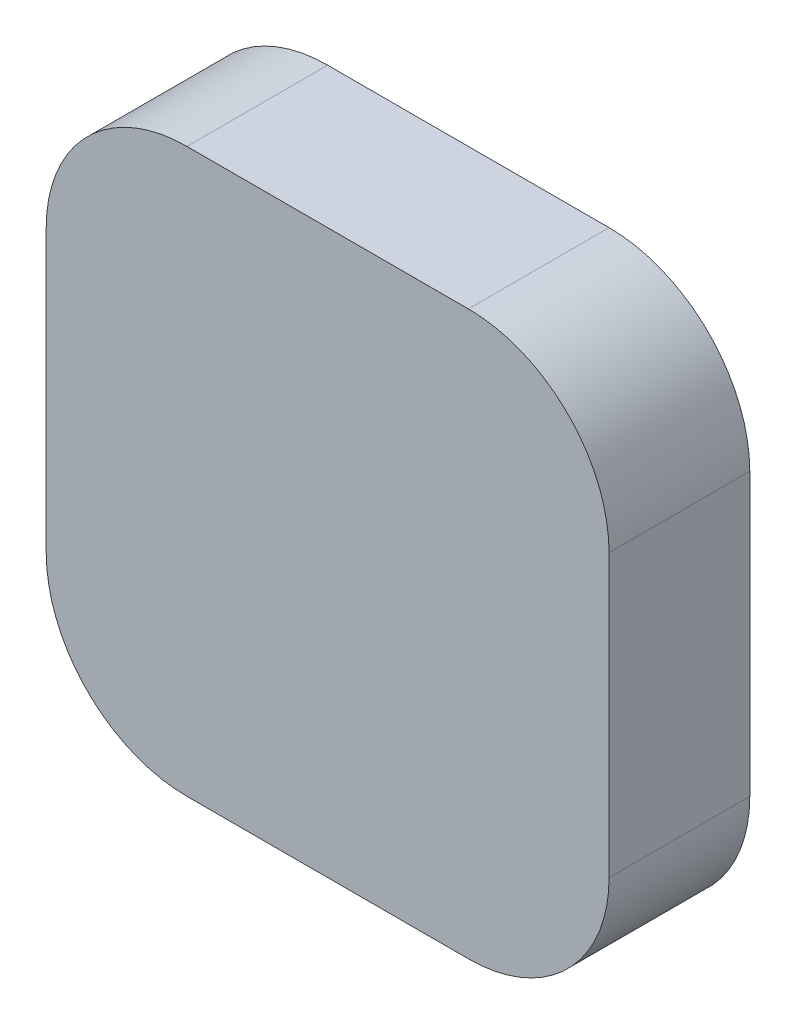
ISO-10303-21;
HEADER;
FILE_DESCRIPTION(('STEP AP214'),'2;1');
FILE_NAME('part.step','',(''),(''),'','','');
FILE_SCHEMA(('AUTOMOTIVE_DESIGN { 1 0 10303 214 1 1 1 1 }'));
ENDSEC;
DATA;
#1=APPLICATION_CONTEXT('core data for automotive mechanical design processes');
#2=APPLICATION_PROTOCOL_DEFINITION('international standard','automotive_design',2000,#1);
#3=PRODUCT_CONTEXT('',#1,'mechanical');
#4=PRODUCT('Part','Part','',(#3));
#5=PRODUCT_RELATED_PRODUCT_CATEGORY('part','',(#4));
#6=PRODUCT_DEFINITION_FORMATION('','',#4);
#7=PRODUCT_DEFINITION_CONTEXT('part definition',#1,'design');
#8=PRODUCT_DEFINITION('design','',#6,#7);
#9=PRODUCT_DEFINITION_SHAPE('','',#8);
#10=(LENGTH_UNIT() NAMED_UNIT(*) SI_UNIT(.MILLI.,.METRE.));
#11=(NAMED_UNIT(*) PLANE_ANGLE_UNIT() SI_UNIT($,.RADIAN.));
#12=(NAMED_UNIT(*) SI_UNIT($,.STERADIAN.) SOLID_ANGLE_UNIT());
#13=UNCERTAINTY_MEASURE_WITH_UNIT(LENGTH_MEASURE(1.E-05),#10,'distance_accuracy_value','');
#14=(GEOMETRIC_REPRESENTATION_CONTEXT(3) GLOBAL_UNCERTAINTY_ASSIGNED_CONTEXT((#13)) GLOBAL_UNIT_ASSIGNED_CONTEXT((#10,
#11,#12)) REPRESENTATION_CONTEXT('',''));
#15=CARTESIAN_POINT('',(0.,0.,0.));
#16=DIRECTION('',(0.,0.,1.));
#17=DIRECTION('',(1.,0.,0.));
#18=AXIS2_PLACEMENT_3D('',#15,#16,#17);
#19=CARTESIAN_POINT('',(0.,0.,5.));
#20=DIRECTION('',(1.,0.,0.));
#21=DIRECTION('',(0.,0.,-1.));
#22=AXIS2_PLACEMENT_3D('',#19,#20,#21);
#23=PLANE('',#22);
#24=DIRECTION('',(0.,-1.,0.));
#25=VECTOR('',#24,1.);
#26=CARTESIAN_POINT('',(0.,0.,0.));
#27=LINE('',#26,#25);
#28=CARTESIAN_POINT('',(0.,15.,0.));
#29=VERTEX_POINT('',#28);
#30=CARTESIAN_POINT('',(0.,5.,0.));
#31=VERTEX_POINT('',#30);
#32=EDGE_CURVE('E128',#29,#31,#27,.T.);
#33=ORIENTED_EDGE('',*,*,#32,.T.);
#34=DIRECTION('',(0.,0.,-1.));
#35=VECTOR('',#34,1.);
#36=CARTESIAN_POINT('',(0.,5.,5.));
#37=LINE('',#36,#35);
#38=CARTESIAN_POINT('',(0.,5.,5.));
#39=VERTEX_POINT('',#38);
#40=EDGE_CURVE('E151',#31,#39,#37,.F.);
#41=ORIENTED_EDGE('',*,*,#40,.T.);
#42=DIRECTION('',(0.,-1.,0.));
#43=VECTOR('',#42,1.);
#44=CARTESIAN_POINT('',(0.,0.,5.));
#45=LINE('',#44,#43);
#46=CARTESIAN_POINT('',(0.,15.,5.));
#47=VERTEX_POINT('',#46);
#48=EDGE_CURVE('E126',#47,#39,#45,.T.);
#49=ORIENTED_EDGE('',*,*,#48,.F.);
#50=DIRECTION('',(0.,0.,-1.));
#51=VECTOR('',#50,1.);
#52=CARTESIAN_POINT('',(0.,15.,5.));
#53=LINE('',#52,#51);
#54=EDGE_CURVE('E148',#47,#29,#53,.T.);
#55=ORIENTED_EDGE('',*,*,#54,.T.);
#56=EDGE_LOOP('',(#33,#41,#49,#55));
#57=FACE_BOUND('',#56,.T.);
#58=ADVANCED_FACE('F33',(#57),#23,.F.);
#59=CARTESIAN_POINT('',(0.,0.,5.));
#60=DIRECTION('',(0.,1.,0.));
#61=DIRECTION('',(0.,0.,1.));
#62=AXIS2_PLACEMENT_3D('',#59,#60,#61);
#63=PLANE('',#62);
#64=DIRECTION('',(1.,0.,0.));
#65=VECTOR('',#64,1.);
#66=CARTESIAN_POINT('',(0.,0.,0.));
#67=LINE('',#66,#65);
#68=CARTESIAN_POINT('',(5.,0.,0.));
#69=VERTEX_POINT('',#68);
#70=CARTESIAN_POINT('',(15.,0.,0.));
#71=VERTEX_POINT('',#70);
#72=EDGE_CURVE('E124',#69,#71,#67,.T.);
#73=ORIENTED_EDGE('',*,*,#72,.T.);
#74=DIRECTION('',(0.,0.,-1.));
#75=VECTOR('',#74,1.);
#76=CARTESIAN_POINT('',(15.,0.,5.));
#77=LINE('',#76,#75);
#78=CARTESIAN_POINT('',(15.,0.,5.));
#79=VERTEX_POINT('',#78);
#80=EDGE_CURVE('E103',#71,#79,#77,.F.);
#81=ORIENTED_EDGE('',*,*,#80,.T.);
#82=DIRECTION('',(1.,0.,0.));
#83=VECTOR('',#82,1.);
#84=CARTESIAN_POINT('',(0.,0.,5.));
#85=LINE('',#84,#83);
#86=CARTESIAN_POINT('',(5.,0.,5.));
#87=VERTEX_POINT('',#86);
#88=EDGE_CURVE('E167',#87,#79,#85,.T.);
#89=ORIENTED_EDGE('',*,*,#88,.F.);
#90=DIRECTION('',(0.,0.,-1.));
#91=VECTOR('',#90,1.);
#92=CARTESIAN_POINT('',(5.,0.,5.));
#93=LINE('',#92,#91);
#94=EDGE_CURVE('E108',#87,#69,#93,.T.);
#95=ORIENTED_EDGE('',*,*,#94,.T.);
#96=EDGE_LOOP('',(#73,#81,#89,#95));
#97=FACE_BOUND('',#96,.T.);
#98=ADVANCED_FACE('F184',(#97),#63,.F.);
#99=CARTESIAN_POINT('',(20.,0.,5.));
#100=DIRECTION('',(-1.,0.,0.));
#101=DIRECTION('',(0.,0.,1.));
#102=AXIS2_PLACEMENT_3D('',#99,#100,#101);
#103=PLANE('',#102);
#104=DIRECTION('',(0.,1.,0.));
#105=VECTOR('',#104,1.);
#106=CARTESIAN_POINT('',(20.,0.,5.));
#107=LINE('',#106,#105);
#108=CARTESIAN_POINT('',(20.,5.,5.));
#109=VERTEX_POINT('',#108);
#110=CARTESIAN_POINT('',(20.,15.,5.));
#111=VERTEX_POINT('',#110);
#112=EDGE_CURVE('E117',#109,#111,#107,.T.);
#113=ORIENTED_EDGE('',*,*,#112,.F.);
#114=DIRECTION('',(0.,0.,-1.));
#115=VECTOR('',#114,1.);
#116=CARTESIAN_POINT('',(20.,5.,5.));
#117=LINE('',#116,#115);
#118=CARTESIAN_POINT('',(20.,5.,0.));
#119=VERTEX_POINT('',#118);
#120=EDGE_CURVE('E102',#109,#119,#117,.T.);
#121=ORIENTED_EDGE('',*,*,#120,.T.);
#122=DIRECTION('',(0.,1.,0.));
#123=VECTOR('',#122,1.);
#124=CARTESIAN_POINT('',(20.,0.,0.));
#125=LINE('',#124,#123);
#126=CARTESIAN_POINT('',(20.,15.,0.));
#127=VERTEX_POINT('',#126);
#128=EDGE_CURVE('E115',#119,#127,#125,.T.);
#129=ORIENTED_EDGE('',*,*,#128,.T.);
#130=DIRECTION('',(0.,0.,-1.));
#131=VECTOR('',#130,1.);
#132=CARTESIAN_POINT('',(20.,15.,5.));
#133=LINE('',#132,#131);
#134=EDGE_CURVE('E119',#127,#111,#133,.F.);
#135=ORIENTED_EDGE('',*,*,#134,.T.);
#136=EDGE_LOOP('',(#113,#121,#129,#135));
#137=FACE_BOUND('',#136,.T.);
#138=ADVANCED_FACE('F114',(#137),#103,.F.);
#139=CARTESIAN_POINT('',(0.,20.,5.));
#140=DIRECTION('',(0.,-1.,0.));
#141=DIRECTION('',(0.,0.,-1.));
#142=AXIS2_PLACEMENT_3D('',#139,#140,#141);
#143=PLANE('',#142);
#144=DIRECTION('',(-1.,0.,0.));
#145=VECTOR('',#144,1.);
#146=CARTESIAN_POINT('',(0.,20.,0.));
#147=LINE('',#146,#145);
#148=CARTESIAN_POINT('',(15.,20.,0.));
#149=VERTEX_POINT('',#148);
#150=CARTESIAN_POINT('',(5.,20.,0.));
#151=VERTEX_POINT('',#150);
#152=EDGE_CURVE('E123',#149,#151,#147,.T.);
#153=ORIENTED_EDGE('',*,*,#152,.T.);
#154=DIRECTION('',(0.,0.,-1.));
#155=VECTOR('',#154,1.);
#156=CARTESIAN_POINT('',(5.,20.,5.));
#157=LINE('',#156,#155);
#158=CARTESIAN_POINT('',(5.,20.,5.));
#159=VERTEX_POINT('',#158);
#160=EDGE_CURVE('E11',#151,#159,#157,.F.);
#161=ORIENTED_EDGE('',*,*,#160,.T.);
#162=DIRECTION('',(-1.,0.,0.));
#163=VECTOR('',#162,1.);
#164=CARTESIAN_POINT('',(0.,20.,5.));
#165=LINE('',#164,#163);
#166=CARTESIAN_POINT('',(15.,20.,5.));
#167=VERTEX_POINT('',#166);
#168=EDGE_CURVE('E132',#167,#159,#165,.T.);
#169=ORIENTED_EDGE('',*,*,#168,.F.);
#170=DIRECTION('',(0.,0.,-1.));
#171=VECTOR('',#170,1.);
#172=CARTESIAN_POINT('',(15.,20.,5.));
#173=LINE('',#172,#171);
#174=EDGE_CURVE('E41',#167,#149,#173,.T.);
#175=ORIENTED_EDGE('',*,*,#174,.T.);
#176=EDGE_LOOP('',(#153,#161,#169,#175));
#177=FACE_BOUND('',#176,.T.);
#178=ADVANCED_FACE('F154',(#177),#143,.F.);
#179=CARTESIAN_POINT('',(0.,0.,5.));
#180=DIRECTION('',(0.,0.,-1.));
#181=DIRECTION('',(-1.,0.,0.));
#182=AXIS2_PLACEMENT_3D('',#179,#180,#181);
#183=PLANE('',#182);
#184=ORIENTED_EDGE('',*,*,#88,.T.);
#185=CARTESIAN_POINT('',(15.,5.,5.));
#186=DIRECTION('',(0.,0.,-1.));
#187=DIRECTION('',(-1.,0.,0.));
#188=AXIS2_PLACEMENT_3D('',#185,#186,#187);
#189=CIRCLE('',#188,5.);
#190=EDGE_CURVE('E146',#79,#109,#189,.F.);
#191=ORIENTED_EDGE('',*,*,#190,.T.);
#192=ORIENTED_EDGE('',*,*,#112,.T.);
#193=CARTESIAN_POINT('',(15.,15.,5.));
#194=DIRECTION('',(0.,0.,-1.));
#195=DIRECTION('',(-1.,0.,0.));
#196=AXIS2_PLACEMENT_3D('',#193,#194,#195);
#197=CIRCLE('',#196,5.);
#198=EDGE_CURVE('E53',#111,#167,#197,.F.);
#199=ORIENTED_EDGE('',*,*,#198,.T.);
#200=ORIENTED_EDGE('',*,*,#168,.T.);
#201=CARTESIAN_POINT('',(5.,15.,5.));
#202=DIRECTION('',(0.,0.,-1.));
#203=DIRECTION('',(-1.,0.,0.));
#204=AXIS2_PLACEMENT_3D('',#201,#202,#203);
#205=CIRCLE('',#204,5.);
#206=EDGE_CURVE('E142',#159,#47,#205,.F.);
#207=ORIENTED_EDGE('',*,*,#206,.T.);
#208=ORIENTED_EDGE('',*,*,#48,.T.);
#209=CARTESIAN_POINT('',(5.,5.,5.));
#210=DIRECTION('',(0.,0.,-1.));
#211=DIRECTION('',(-1.,0.,0.));
#212=AXIS2_PLACEMENT_3D('',#209,#210,#211);
#213=CIRCLE('',#212,5.);
#214=EDGE_CURVE('E144',#39,#87,#213,.F.);
#215=ORIENTED_EDGE('',*,*,#214,.T.);
#216=EDGE_LOOP('',(#184,#191,#192,#199,#200,#207,#208,#215));
#217=FACE_BOUND('',#216,.T.);
#218=ADVANCED_FACE('F173',(#217),#183,.F.);
#219=CARTESIAN_POINT('',(0.,0.,0.));
#220=DIRECTION('',(0.,0.,-1.));
#221=DIRECTION('',(-1.,0.,0.));
#222=AXIS2_PLACEMENT_3D('',#219,#220,#221);
#223=PLANE('',#222);
#224=ORIENTED_EDGE('',*,*,#128,.F.);
#225=CARTESIAN_POINT('',(15.,5.,0.));
#226=DIRECTION('',(0.,0.,-1.));
#227=DIRECTION('',(-1.,0.,0.));
#228=AXIS2_PLACEMENT_3D('',#225,#226,#227);
#229=CIRCLE('',#228,5.);
#230=EDGE_CURVE('E98',#119,#71,#229,.T.);
#231=ORIENTED_EDGE('',*,*,#230,.T.);
#232=ORIENTED_EDGE('',*,*,#72,.F.);
#233=CARTESIAN_POINT('',(5.,5.,0.));
#234=DIRECTION('',(0.,0.,-1.));
#235=DIRECTION('',(-1.,0.,0.));
#236=AXIS2_PLACEMENT_3D('',#233,#234,#235);
#237=CIRCLE('',#236,5.);
#238=EDGE_CURVE('E109',#69,#31,#237,.T.);
#239=ORIENTED_EDGE('',*,*,#238,.T.);
#240=ORIENTED_EDGE('',*,*,#32,.F.);
#241=CARTESIAN_POINT('',(5.,15.,0.));
#242=DIRECTION('',(0.,0.,-1.));
#243=DIRECTION('',(-1.,0.,0.));
#244=AXIS2_PLACEMENT_3D('',#241,#242,#243);
#245=CIRCLE('',#244,5.);
#246=EDGE_CURVE('E135',#29,#151,#245,.T.);
#247=ORIENTED_EDGE('',*,*,#246,.T.);
#248=ORIENTED_EDGE('',*,*,#152,.F.);
#249=CARTESIAN_POINT('',(15.,15.,0.));
#250=DIRECTION('',(0.,0.,-1.));
#251=DIRECTION('',(-1.,0.,0.));
#252=AXIS2_PLACEMENT_3D('',#249,#250,#251);
#253=CIRCLE('',#252,5.);
#254=EDGE_CURVE('E118',#149,#127,#253,.T.);
#255=ORIENTED_EDGE('',*,*,#254,.T.);
#256=EDGE_LOOP('',(#224,#231,#232,#239,#240,#247,#248,#255));
#257=FACE_BOUND('',#256,.T.);
#258=ADVANCED_FACE('F121',(#257),#223,.T.);
#259=CARTESIAN_POINT('',(15.,5.,5.));
#260=DIRECTION('',(0.,0.,-1.));
#261=DIRECTION('',(-1.,0.,0.));
#262=AXIS2_PLACEMENT_3D('',#259,#260,#261);
#263=CYLINDRICAL_SURFACE('',#262,5.);
#264=ORIENTED_EDGE('',*,*,#190,.F.);
#265=ORIENTED_EDGE('',*,*,#80,.F.);
#266=ORIENTED_EDGE('',*,*,#230,.F.);
#267=ORIENTED_EDGE('',*,*,#120,.F.);
#268=EDGE_LOOP('',(#264,#265,#266,#267));
#269=FACE_BOUND('',#268,.T.);
#270=ADVANCED_FACE('F101',(#269),#263,.T.);
#271=CARTESIAN_POINT('',(5.,5.,5.));
#272=DIRECTION('',(0.,0.,-1.));
#273=DIRECTION('',(-1.,0.,0.));
#274=AXIS2_PLACEMENT_3D('',#271,#272,#273);
#275=CYLINDRICAL_SURFACE('',#274,5.);
#276=ORIENTED_EDGE('',*,*,#214,.F.);
#277=ORIENTED_EDGE('',*,*,#40,.F.);
#278=ORIENTED_EDGE('',*,*,#238,.F.);
#279=ORIENTED_EDGE('',*,*,#94,.F.);
#280=EDGE_LOOP('',(#276,#277,#278,#279));
#281=FACE_BOUND('',#280,.T.);
#282=ADVANCED_FACE('F195',(#281),#275,.T.);
#283=CARTESIAN_POINT('',(5.,15.,5.));
#284=DIRECTION('',(0.,0.,-1.));
#285=DIRECTION('',(-1.,0.,0.));
#286=AXIS2_PLACEMENT_3D('',#283,#284,#285);
#287=CYLINDRICAL_SURFACE('',#286,5.);
#288=ORIENTED_EDGE('',*,*,#206,.F.);
#289=ORIENTED_EDGE('',*,*,#160,.F.);
#290=ORIENTED_EDGE('',*,*,#246,.F.);
#291=ORIENTED_EDGE('',*,*,#54,.F.);
#292=EDGE_LOOP('',(#288,#289,#290,#291));
#293=FACE_BOUND('',#292,.T.);
#294=ADVANCED_FACE('F161',(#293),#287,.T.);
#295=CARTESIAN_POINT('',(15.,15.,5.));
#296=DIRECTION('',(0.,0.,-1.));
#297=DIRECTION('',(-1.,0.,0.));
#298=AXIS2_PLACEMENT_3D('',#295,#296,#297);
#299=CYLINDRICAL_SURFACE('',#298,5.);
#300=ORIENTED_EDGE('',*,*,#198,.F.);
#301=ORIENTED_EDGE('',*,*,#134,.F.);
#302=ORIENTED_EDGE('',*,*,#254,.F.);
#303=ORIENTED_EDGE('',*,*,#174,.F.);
#304=EDGE_LOOP('',(#300,#301,#302,#303));
#305=FACE_BOUND('',#304,.T.);
#306=ADVANCED_FACE('F35',(#305),#299,.T.);
#307=CLOSED_SHELL('',(#58,#98,#138,#178,#218,#258,#270,#282,#294,#306));
#308=MANIFOLD_SOLID_BREP('B2',#307);
#309=ADVANCED_BREP_SHAPE_REPRESENTATION('',(#18,#308),#14);
#310=SHAPE_DEFINITION_REPRESENTATION(#9,#309);
ENDSEC;
END-ISO-10303-21;
